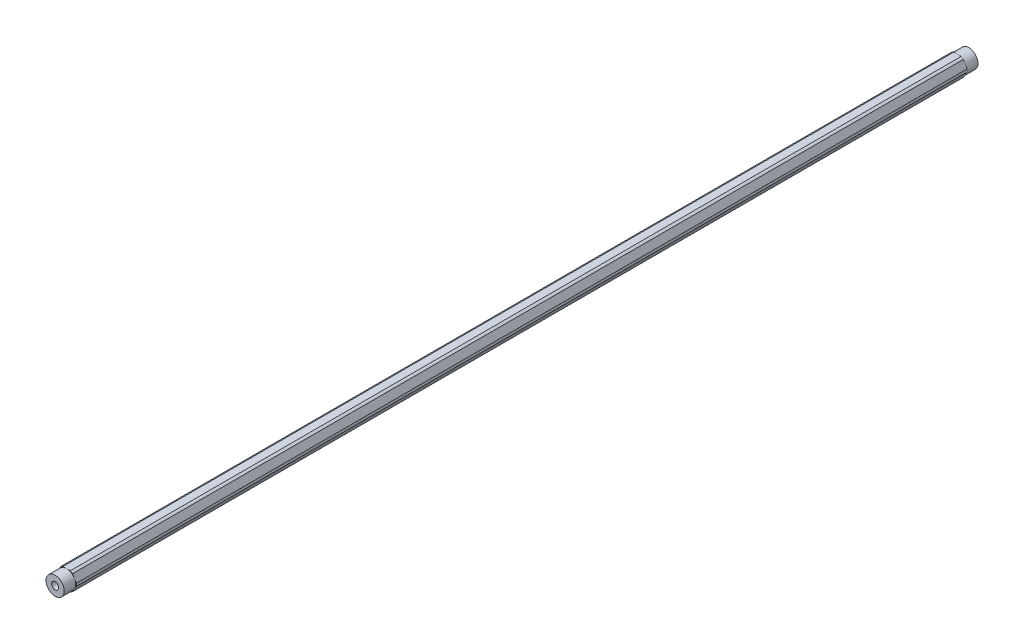
ISO-10303-21;
HEADER;
FILE_DESCRIPTION(('STEP AP214'),'2;1');
FILE_NAME('part.step','',(''),(''),'','','');
FILE_SCHEMA(('AUTOMOTIVE_DESIGN { 1 0 10303 214 1 1 1 1 }'));
ENDSEC;
DATA;
#1=APPLICATION_CONTEXT('core data for automotive mechanical design processes');
#2=APPLICATION_PROTOCOL_DEFINITION('international standard','automotive_design',2000,#1);
#3=PRODUCT_CONTEXT('',#1,'mechanical');
#4=PRODUCT('Part','Part','',(#3));
#5=PRODUCT_RELATED_PRODUCT_CATEGORY('part','',(#4));
#6=PRODUCT_DEFINITION_FORMATION('','',#4);
#7=PRODUCT_DEFINITION_CONTEXT('part definition',#1,'design');
#8=PRODUCT_DEFINITION('design','',#6,#7);
#9=PRODUCT_DEFINITION_SHAPE('','',#8);
#10=(LENGTH_UNIT() NAMED_UNIT(*) SI_UNIT(.MILLI.,.METRE.));
#11=(NAMED_UNIT(*) PLANE_ANGLE_UNIT() SI_UNIT($,.RADIAN.));
#12=(NAMED_UNIT(*) SI_UNIT($,.STERADIAN.) SOLID_ANGLE_UNIT());
#13=UNCERTAINTY_MEASURE_WITH_UNIT(LENGTH_MEASURE(1.E-05),#10,'distance_accuracy_value','');
#14=(GEOMETRIC_REPRESENTATION_CONTEXT(3) GLOBAL_UNCERTAINTY_ASSIGNED_CONTEXT((#13)) GLOBAL_UNIT_ASSIGNED_CONTEXT((#10,
#11,#12)) REPRESENTATION_CONTEXT('',''));
#15=CARTESIAN_POINT('',(0.,0.,0.));
#16=DIRECTION('',(0.,0.,1.));
#17=DIRECTION('',(1.,0.,0.));
#18=AXIS2_PLACEMENT_3D('',#15,#16,#17);
#19=CARTESIAN_POINT('',(3.66617420935413,-6.35,317.5));
#20=DIRECTION('',(-0.866025403784439,0.499999999999999,0.));
#21=DIRECTION('',(-0.5,-0.866025403784439,0.));
#22=AXIS2_PLACEMENT_3D('',#19,#20,#21);
#23=PLANE('',#22);
#24=DIRECTION('',(0.,0.,1.));
#25=VECTOR('',#24,1.);
#26=CARTESIAN_POINT('',(4.20411035757863,-5.41826726004727,-317.5));
#27=LINE('',#26,#25);
#28=CARTESIAN_POINT('',(4.20411035757863,-5.41826726004727,-309.5498));
#29=VERTEX_POINT('',#28);
#30=CARTESIAN_POINT('',(4.20411035757863,-5.41826726004727,309.5498));
#31=VERTEX_POINT('',#30);
#32=EDGE_CURVE('E327',#29,#31,#27,.T.);
#33=ORIENTED_EDGE('',*,*,#32,.F.);
#34=DIRECTION('',(-0.5,-0.866025403784439,0.));
#35=VECTOR('',#34,1.);
#36=CARTESIAN_POINT('',(3.66617420935413,-6.35,-309.5498));
#37=LINE('',#36,#35);
#38=CARTESIAN_POINT('',(5.49926131403119,-3.175,-309.5498));
#39=VERTEX_POINT('',#38);
#40=EDGE_CURVE('E257',#39,#29,#37,.T.);
#41=ORIENTED_EDGE('',*,*,#40,.F.);
#42=CARTESIAN_POINT('',(6.79441227048375,-0.931732739952732,-309.5498));
#43=VERTEX_POINT('',#42);
#44=EDGE_CURVE('E261',#43,#39,#37,.T.);
#45=ORIENTED_EDGE('',*,*,#44,.F.);
#46=DIRECTION('',(0.,0.,1.));
#47=VECTOR('',#46,1.);
#48=CARTESIAN_POINT('',(6.79441227048375,-0.93173273995273,-317.5));
#49=LINE('',#48,#47);
#50=CARTESIAN_POINT('',(6.79441227048375,-0.93173273995273,309.5498));
#51=VERTEX_POINT('',#50);
#52=EDGE_CURVE('E299',#51,#43,#49,.F.);
#53=ORIENTED_EDGE('',*,*,#52,.F.);
#54=DIRECTION('',(0.5,0.866025403784439,0.));
#55=VECTOR('',#54,1.);
#56=CARTESIAN_POINT('',(3.66617420935413,-6.35,309.5498));
#57=LINE('',#56,#55);
#58=CARTESIAN_POINT('',(5.49926131403119,-3.175,309.5498));
#59=VERTEX_POINT('',#58);
#60=EDGE_CURVE('E212',#59,#51,#57,.T.);
#61=ORIENTED_EDGE('',*,*,#60,.F.);
#62=EDGE_CURVE('E211',#31,#59,#57,.T.);
#63=ORIENTED_EDGE('',*,*,#62,.F.);
#64=EDGE_LOOP('',(#33,#41,#45,#53,#61,#63));
#65=FACE_BOUND('',#64,.T.);
#66=ADVANCED_FACE('F48',(#65),#23,.F.);
#67=CARTESIAN_POINT('',(7.33234841870825,0.,317.5));
#68=DIRECTION('',(-0.866025403784439,-0.5,0.));
#69=DIRECTION('',(0.5,-0.866025403784439,0.));
#70=AXIS2_PLACEMENT_3D('',#67,#68,#69);
#71=PLANE('',#70);
#72=DIRECTION('',(0.,0.,1.));
#73=VECTOR('',#72,1.);
#74=CARTESIAN_POINT('',(6.79441227048375,0.931732739952727,-317.5));
#75=LINE('',#74,#73);
#76=CARTESIAN_POINT('',(6.79441227048375,0.931732739952733,-309.5498));
#77=VERTEX_POINT('',#76);
#78=CARTESIAN_POINT('',(6.79441227048375,0.931732739952727,309.5498));
#79=VERTEX_POINT('',#78);
#80=EDGE_CURVE('E302',#77,#79,#75,.T.);
#81=ORIENTED_EDGE('',*,*,#80,.F.);
#82=DIRECTION('',(0.5,-0.866025403784439,0.));
#83=VECTOR('',#82,1.);
#84=CARTESIAN_POINT('',(7.33234841870825,0.,-309.5498));
#85=LINE('',#84,#83);
#86=CARTESIAN_POINT('',(5.49926131403119,3.175,-309.5498));
#87=VERTEX_POINT('',#86);
#88=EDGE_CURVE('E248',#87,#77,#85,.T.);
#89=ORIENTED_EDGE('',*,*,#88,.F.);
#90=CARTESIAN_POINT('',(4.20411035757862,5.41826726004727,-309.5498));
#91=VERTEX_POINT('',#90);
#92=EDGE_CURVE('E252',#91,#87,#85,.T.);
#93=ORIENTED_EDGE('',*,*,#92,.F.);
#94=DIRECTION('',(0.,0.,1.));
#95=VECTOR('',#94,1.);
#96=CARTESIAN_POINT('',(4.20411035757862,5.41826726004727,-317.5));
#97=LINE('',#96,#95);
#98=CARTESIAN_POINT('',(4.20411035757862,5.41826726004727,309.5498));
#99=VERTEX_POINT('',#98);
#100=EDGE_CURVE('E71',#99,#91,#97,.F.);
#101=ORIENTED_EDGE('',*,*,#100,.F.);
#102=DIRECTION('',(-0.5,0.866025403784439,0.));
#103=VECTOR('',#102,1.);
#104=CARTESIAN_POINT('',(7.33234841870825,0.,309.5498));
#105=LINE('',#104,#103);
#106=CARTESIAN_POINT('',(5.49926131403119,3.175,309.5498));
#107=VERTEX_POINT('',#106);
#108=EDGE_CURVE('E217',#107,#99,#105,.T.);
#109=ORIENTED_EDGE('',*,*,#108,.F.);
#110=EDGE_CURVE('E216',#79,#107,#105,.T.);
#111=ORIENTED_EDGE('',*,*,#110,.F.);
#112=EDGE_LOOP('',(#81,#89,#93,#101,#109,#111));
#113=FACE_BOUND('',#112,.T.);
#114=ADVANCED_FACE('F427',(#113),#71,.F.);
#115=CARTESIAN_POINT('',(3.66617420935412,6.35,317.5));
#116=DIRECTION('',(0.,-1.,0.));
#117=DIRECTION('',(0.,0.,-1.));
#118=AXIS2_PLACEMENT_3D('',#115,#116,#117);
#119=PLANE('',#118);
#120=DIRECTION('',(0.,0.,1.));
#121=VECTOR('',#120,1.);
#122=CARTESIAN_POINT('',(2.59030191290514,6.35,-317.5));
#123=LINE('',#122,#121);
#124=CARTESIAN_POINT('',(2.59030191290514,6.35,-309.5498));
#125=VERTEX_POINT('',#124);
#126=CARTESIAN_POINT('',(2.59030191290514,6.35,309.5498));
#127=VERTEX_POINT('',#126);
#128=EDGE_CURVE('E289',#125,#127,#123,.T.);
#129=ORIENTED_EDGE('',*,*,#128,.F.);
#130=DIRECTION('',(1.,0.,0.));
#131=VECTOR('',#130,1.);
#132=CARTESIAN_POINT('',(3.66617420935412,6.35,-309.5498));
#133=LINE('',#132,#131);
#134=CARTESIAN_POINT('',(0.,6.35,-309.5498));
#135=VERTEX_POINT('',#134);
#136=EDGE_CURVE('E242',#135,#125,#133,.T.);
#137=ORIENTED_EDGE('',*,*,#136,.F.);
#138=CARTESIAN_POINT('',(-2.59030191290514,6.35,-309.5498));
#139=VERTEX_POINT('',#138);
#140=EDGE_CURVE('E246',#139,#135,#133,.T.);
#141=ORIENTED_EDGE('',*,*,#140,.F.);
#142=DIRECTION('',(0.,0.,1.));
#143=VECTOR('',#142,1.);
#144=CARTESIAN_POINT('',(-2.59030191290514,6.35,-317.5));
#145=LINE('',#144,#143);
#146=CARTESIAN_POINT('',(-2.59030191290514,6.35,309.5498));
#147=VERTEX_POINT('',#146);
#148=EDGE_CURVE('E63',#147,#139,#145,.F.);
#149=ORIENTED_EDGE('',*,*,#148,.F.);
#150=DIRECTION('',(-1.,0.,0.));
#151=VECTOR('',#150,1.);
#152=CARTESIAN_POINT('',(3.66617420935412,6.35,309.5498));
#153=LINE('',#152,#151);
#154=CARTESIAN_POINT('',(0.,6.35,309.5498));
#155=VERTEX_POINT('',#154);
#156=EDGE_CURVE('E222',#155,#147,#153,.T.);
#157=ORIENTED_EDGE('',*,*,#156,.F.);
#158=EDGE_CURVE('E221',#127,#155,#153,.T.);
#159=ORIENTED_EDGE('',*,*,#158,.F.);
#160=EDGE_LOOP('',(#129,#137,#141,#149,#157,#159));
#161=FACE_BOUND('',#160,.T.);
#162=ADVANCED_FACE('F417',(#161),#119,.F.);
#163=CARTESIAN_POINT('',(-3.66617420935412,6.35,317.5));
#164=DIRECTION('',(0.866025403784439,-0.499999999999999,0.));
#165=DIRECTION('',(0.5,0.866025403784439,0.));
#166=AXIS2_PLACEMENT_3D('',#163,#164,#165);
#167=PLANE('',#166);
#168=DIRECTION('',(0.,0.,1.));
#169=VECTOR('',#168,1.);
#170=CARTESIAN_POINT('',(-4.20411035757862,5.41826726004727,-317.5));
#171=LINE('',#170,#169);
#172=CARTESIAN_POINT('',(-4.20411035757862,5.41826726004727,-309.5498));
#173=VERTEX_POINT('',#172);
#174=CARTESIAN_POINT('',(-4.20411035757862,5.41826726004727,309.5498));
#175=VERTEX_POINT('',#174);
#176=EDGE_CURVE('E277',#173,#175,#171,.T.);
#177=ORIENTED_EDGE('',*,*,#176,.F.);
#178=DIRECTION('',(0.5,0.866025403784439,0.));
#179=VECTOR('',#178,1.);
#180=CARTESIAN_POINT('',(-3.66617420935412,6.35,-309.5498));
#181=LINE('',#180,#179);
#182=CARTESIAN_POINT('',(-5.49926131403119,3.175,-309.5498));
#183=VERTEX_POINT('',#182);
#184=EDGE_CURVE('E247',#183,#173,#181,.T.);
#185=ORIENTED_EDGE('',*,*,#184,.F.);
#186=CARTESIAN_POINT('',(-6.79441227048376,0.931732739952722,-309.5498));
#187=VERTEX_POINT('',#186);
#188=EDGE_CURVE('E253',#187,#183,#181,.T.);
#189=ORIENTED_EDGE('',*,*,#188,.F.);
#190=DIRECTION('',(0.,0.,1.));
#191=VECTOR('',#190,1.);
#192=CARTESIAN_POINT('',(-6.79441227048375,0.931732739952721,-317.5));
#193=LINE('',#192,#191);
#194=CARTESIAN_POINT('',(-6.79441227048375,0.931732739952721,309.5498));
#195=VERTEX_POINT('',#194);
#196=EDGE_CURVE('E313',#195,#187,#193,.F.);
#197=ORIENTED_EDGE('',*,*,#196,.F.);
#198=DIRECTION('',(-0.5,-0.866025403784439,0.));
#199=VECTOR('',#198,1.);
#200=CARTESIAN_POINT('',(-3.66617420935412,6.35,309.5498));
#201=LINE('',#200,#199);
#202=CARTESIAN_POINT('',(-5.49926131403119,3.175,309.5498));
#203=VERTEX_POINT('',#202);
#204=EDGE_CURVE('E227',#203,#195,#201,.T.);
#205=ORIENTED_EDGE('',*,*,#204,.F.);
#206=EDGE_CURVE('E226',#175,#203,#201,.T.);
#207=ORIENTED_EDGE('',*,*,#206,.F.);
#208=EDGE_LOOP('',(#177,#185,#189,#197,#205,#207));
#209=FACE_BOUND('',#208,.T.);
#210=ADVANCED_FACE('F433',(#209),#167,.F.);
#211=CARTESIAN_POINT('',(-7.33234841870825,0.,317.5));
#212=DIRECTION('',(0.866025403784438,0.5,0.));
#213=DIRECTION('',(-0.5,0.866025403784439,0.));
#214=AXIS2_PLACEMENT_3D('',#211,#212,#213);
#215=PLANE('',#214);
#216=DIRECTION('',(0.,0.,1.));
#217=VECTOR('',#216,1.);
#218=CARTESIAN_POINT('',(-6.79441227048375,-0.931732739952721,-317.5));
#219=LINE('',#218,#217);
#220=CARTESIAN_POINT('',(-6.79441227048375,-0.931732739952727,-309.5498));
#221=VERTEX_POINT('',#220);
#222=CARTESIAN_POINT('',(-6.79441227048375,-0.931732739952721,309.5498));
#223=VERTEX_POINT('',#222);
#224=EDGE_CURVE('E316',#221,#223,#219,.T.);
#225=ORIENTED_EDGE('',*,*,#224,.F.);
#226=DIRECTION('',(-0.5,0.866025403784439,0.));
#227=VECTOR('',#226,1.);
#228=CARTESIAN_POINT('',(-7.33234841870825,0.,-309.5498));
#229=LINE('',#228,#227);
#230=CARTESIAN_POINT('',(-5.49926131403119,-3.175,-309.5498));
#231=VERTEX_POINT('',#230);
#232=EDGE_CURVE('E256',#231,#221,#229,.T.);
#233=ORIENTED_EDGE('',*,*,#232,.F.);
#234=CARTESIAN_POINT('',(-4.20411035757862,-5.41826726004728,-309.5498));
#235=VERTEX_POINT('',#234);
#236=EDGE_CURVE('E262',#235,#231,#229,.T.);
#237=ORIENTED_EDGE('',*,*,#236,.F.);
#238=DIRECTION('',(0.,0.,1.));
#239=VECTOR('',#238,1.);
#240=CARTESIAN_POINT('',(-4.20411035757861,-5.41826726004728,-317.5));
#241=LINE('',#240,#239);
#242=CARTESIAN_POINT('',(-4.20411035757861,-5.41826726004728,309.5498));
#243=VERTEX_POINT('',#242);
#244=EDGE_CURVE('E176',#243,#235,#241,.F.);
#245=ORIENTED_EDGE('',*,*,#244,.F.);
#246=DIRECTION('',(0.5,-0.866025403784439,0.));
#247=VECTOR('',#246,1.);
#248=CARTESIAN_POINT('',(-7.33234841870825,0.,309.5498));
#249=LINE('',#248,#247);
#250=CARTESIAN_POINT('',(-5.49926131403119,-3.175,309.5498));
#251=VERTEX_POINT('',#250);
#252=EDGE_CURVE('E232',#251,#243,#249,.T.);
#253=ORIENTED_EDGE('',*,*,#252,.F.);
#254=EDGE_CURVE('E231',#223,#251,#249,.T.);
#255=ORIENTED_EDGE('',*,*,#254,.F.);
#256=EDGE_LOOP('',(#225,#233,#237,#245,#253,#255));
#257=FACE_BOUND('',#256,.T.);
#258=ADVANCED_FACE('F450',(#257),#215,.F.);
#259=CARTESIAN_POINT('',(-3.66617420935412,-6.35000000000001,317.5));
#260=DIRECTION('',(0.,1.,0.));
#261=DIRECTION('',(-1.,0.,0.));
#262=AXIS2_PLACEMENT_3D('',#259,#260,#261);
#263=PLANE('',#262);
#264=DIRECTION('',(0.,0.,1.));
#265=VECTOR('',#264,1.);
#266=CARTESIAN_POINT('',(-2.59030191290513,-6.35,-317.5));
#267=LINE('',#266,#265);
#268=CARTESIAN_POINT('',(-2.59030191290512,-6.35000000000001,-309.5498));
#269=VERTEX_POINT('',#268);
#270=CARTESIAN_POINT('',(-2.59030191290513,-6.35,309.5498));
#271=VERTEX_POINT('',#270);
#272=EDGE_CURVE('E173',#269,#271,#267,.T.);
#273=ORIENTED_EDGE('',*,*,#272,.F.);
#274=DIRECTION('',(-1.,0.,0.));
#275=VECTOR('',#274,1.);
#276=CARTESIAN_POINT('',(-3.66617420935412,-6.35000000000001,-309.5498));
#277=LINE('',#276,#275);
#278=CARTESIAN_POINT('',(0.,-6.35,-309.5498));
#279=VERTEX_POINT('',#278);
#280=EDGE_CURVE('E185',#279,#269,#277,.T.);
#281=ORIENTED_EDGE('',*,*,#280,.F.);
#282=CARTESIAN_POINT('',(2.59030191290513,-6.35,-309.5498));
#283=VERTEX_POINT('',#282);
#284=EDGE_CURVE('E56',#283,#279,#277,.T.);
#285=ORIENTED_EDGE('',*,*,#284,.F.);
#286=DIRECTION('',(0.,0.,1.));
#287=VECTOR('',#286,1.);
#288=CARTESIAN_POINT('',(2.59030191290513,-6.35,-317.5));
#289=LINE('',#288,#287);
#290=CARTESIAN_POINT('',(2.59030191290513,-6.35,309.5498));
#291=VERTEX_POINT('',#290);
#292=EDGE_CURVE('E330',#291,#283,#289,.F.);
#293=ORIENTED_EDGE('',*,*,#292,.F.);
#294=DIRECTION('',(1.,0.,0.));
#295=VECTOR('',#294,1.);
#296=CARTESIAN_POINT('',(-3.66617420935412,-6.35000000000001,309.5498));
#297=LINE('',#296,#295);
#298=CARTESIAN_POINT('',(0.,-6.35,309.5498));
#299=VERTEX_POINT('',#298);
#300=EDGE_CURVE('E203',#299,#291,#297,.T.);
#301=ORIENTED_EDGE('',*,*,#300,.F.);
#302=EDGE_CURVE('E187',#271,#299,#297,.T.);
#303=ORIENTED_EDGE('',*,*,#302,.F.);
#304=EDGE_LOOP('',(#273,#281,#285,#293,#301,#303));
#305=FACE_BOUND('',#304,.T.);
#306=ADVANCED_FACE('F183',(#305),#263,.F.);
#307=CARTESIAN_POINT('',(0.,0.,309.5498));
#308=DIRECTION('',(0.,0.,1.));
#309=DIRECTION('',(1.,0.,0.));
#310=AXIS2_PLACEMENT_3D('',#307,#308,#309);
#311=PLANE('',#310);
#312=ORIENTED_EDGE('',*,*,#300,.T.);
#313=CARTESIAN_POINT('',(0.,0.,309.5498));
#314=DIRECTION('',(0.,0.,1.));
#315=DIRECTION('',(1.,0.,0.));
#316=AXIS2_PLACEMENT_3D('',#313,#314,#315);
#317=CIRCLE('',#316,6.858);
#318=EDGE_CURVE('E323',#291,#31,#317,.T.);
#319=ORIENTED_EDGE('',*,*,#318,.T.);
#320=ORIENTED_EDGE('',*,*,#62,.T.);
#321=CARTESIAN_POINT('',(0.,0.,309.5498));
#322=DIRECTION('',(0.,0.,1.));
#323=DIRECTION('',(1.,0.,0.));
#324=AXIS2_PLACEMENT_3D('',#321,#322,#323);
#325=CIRCLE('',#324,6.35);
#326=EDGE_CURVE('E375',#299,#59,#325,.T.);
#327=ORIENTED_EDGE('',*,*,#326,.F.);
#328=EDGE_LOOP('',(#312,#319,#320,#327));
#329=FACE_BOUND('',#328,.T.);
#330=ADVANCED_FACE('F480',(#329),#311,.T.);
#331=ORIENTED_EDGE('',*,*,#60,.T.);
#332=CARTESIAN_POINT('',(0.,0.,309.5498));
#333=DIRECTION('',(0.,0.,1.));
#334=DIRECTION('',(1.,0.,0.));
#335=AXIS2_PLACEMENT_3D('',#332,#333,#334);
#336=CIRCLE('',#335,6.858);
#337=EDGE_CURVE('E295',#51,#79,#336,.T.);
#338=ORIENTED_EDGE('',*,*,#337,.T.);
#339=ORIENTED_EDGE('',*,*,#110,.T.);
#340=EDGE_CURVE('E241',#59,#107,#325,.T.);
#341=ORIENTED_EDGE('',*,*,#340,.F.);
#342=EDGE_LOOP('',(#331,#338,#339,#341));
#343=FACE_BOUND('',#342,.T.);
#344=ADVANCED_FACE('F390',(#343),#311,.T.);
#345=ORIENTED_EDGE('',*,*,#108,.T.);
#346=CARTESIAN_POINT('',(0.,0.,309.5498));
#347=DIRECTION('',(0.,0.,1.));
#348=DIRECTION('',(1.,0.,0.));
#349=AXIS2_PLACEMENT_3D('',#346,#347,#348);
#350=CIRCLE('',#349,6.858);
#351=EDGE_CURVE('E283',#99,#127,#350,.T.);
#352=ORIENTED_EDGE('',*,*,#351,.T.);
#353=ORIENTED_EDGE('',*,*,#158,.T.);
#354=EDGE_CURVE('E236',#107,#155,#325,.T.);
#355=ORIENTED_EDGE('',*,*,#354,.F.);
#356=EDGE_LOOP('',(#345,#352,#353,#355));
#357=FACE_BOUND('',#356,.T.);
#358=ADVANCED_FACE('F422',(#357),#311,.T.);
#359=ORIENTED_EDGE('',*,*,#156,.T.);
#360=CARTESIAN_POINT('',(0.,0.,309.5498));
#361=DIRECTION('',(0.,0.,1.));
#362=DIRECTION('',(1.,0.,0.));
#363=AXIS2_PLACEMENT_3D('',#360,#361,#362);
#364=CIRCLE('',#363,6.858);
#365=EDGE_CURVE('E271',#147,#175,#364,.T.);
#366=ORIENTED_EDGE('',*,*,#365,.T.);
#367=ORIENTED_EDGE('',*,*,#206,.T.);
#368=EDGE_CURVE('E240',#155,#203,#325,.T.);
#369=ORIENTED_EDGE('',*,*,#368,.F.);
#370=EDGE_LOOP('',(#359,#366,#367,#369));
#371=FACE_BOUND('',#370,.T.);
#372=ADVANCED_FACE('F438',(#371),#311,.T.);
#373=ORIENTED_EDGE('',*,*,#204,.T.);
#374=CARTESIAN_POINT('',(0.,0.,309.5498));
#375=DIRECTION('',(0.,0.,1.));
#376=DIRECTION('',(1.,0.,0.));
#377=AXIS2_PLACEMENT_3D('',#374,#375,#376);
#378=CIRCLE('',#377,6.858);
#379=EDGE_CURVE('E309',#195,#223,#378,.T.);
#380=ORIENTED_EDGE('',*,*,#379,.T.);
#381=ORIENTED_EDGE('',*,*,#254,.T.);
#382=EDGE_CURVE('E442',#203,#251,#325,.T.);
#383=ORIENTED_EDGE('',*,*,#382,.F.);
#384=EDGE_LOOP('',(#373,#380,#381,#383));
#385=FACE_BOUND('',#384,.T.);
#386=ADVANCED_FACE('F459',(#385),#311,.T.);
#387=ORIENTED_EDGE('',*,*,#252,.T.);
#388=CARTESIAN_POINT('',(0.,0.,309.5498));
#389=DIRECTION('',(0.,0.,1.));
#390=DIRECTION('',(1.,0.,0.));
#391=AXIS2_PLACEMENT_3D('',#388,#389,#390);
#392=CIRCLE('',#391,6.858);
#393=EDGE_CURVE('E337',#243,#271,#392,.T.);
#394=ORIENTED_EDGE('',*,*,#393,.T.);
#395=ORIENTED_EDGE('',*,*,#302,.T.);
#396=EDGE_CURVE('E381',#251,#299,#325,.T.);
#397=ORIENTED_EDGE('',*,*,#396,.F.);
#398=EDGE_LOOP('',(#387,#394,#395,#397));
#399=FACE_BOUND('',#398,.T.);
#400=ADVANCED_FACE('F452',(#399),#311,.T.);
#401=CARTESIAN_POINT('',(0.,0.,-309.5498));
#402=DIRECTION('',(0.,0.,-1.));
#403=DIRECTION('',(-1.,0.,0.));
#404=AXIS2_PLACEMENT_3D('',#401,#402,#403);
#405=PLANE('',#404);
#406=ORIENTED_EDGE('',*,*,#184,.T.);
#407=CARTESIAN_POINT('',(0.,0.,-309.5498));
#408=DIRECTION('',(0.,0.,-1.));
#409=DIRECTION('',(-1.,0.,0.));
#410=AXIS2_PLACEMENT_3D('',#407,#408,#409);
#411=CIRCLE('',#410,6.858);
#412=EDGE_CURVE('E280',#173,#139,#411,.T.);
#413=ORIENTED_EDGE('',*,*,#412,.T.);
#414=ORIENTED_EDGE('',*,*,#140,.T.);
#415=CARTESIAN_POINT('',(0.,0.,-309.5498));
#416=DIRECTION('',(0.,0.,1.));
#417=DIRECTION('',(1.,0.,0.));
#418=AXIS2_PLACEMENT_3D('',#415,#416,#417);
#419=CIRCLE('',#418,6.35);
#420=EDGE_CURVE('E269',#135,#183,#419,.T.);
#421=ORIENTED_EDGE('',*,*,#420,.T.);
#422=EDGE_LOOP('',(#406,#413,#414,#421));
#423=FACE_BOUND('',#422,.T.);
#424=ADVANCED_FACE('F399',(#423),#405,.T.);
#425=ORIENTED_EDGE('',*,*,#136,.T.);
#426=CARTESIAN_POINT('',(0.,0.,-309.5498));
#427=DIRECTION('',(0.,0.,-1.));
#428=DIRECTION('',(-1.,0.,0.));
#429=AXIS2_PLACEMENT_3D('',#426,#427,#428);
#430=CIRCLE('',#429,6.858);
#431=EDGE_CURVE('E292',#125,#91,#430,.T.);
#432=ORIENTED_EDGE('',*,*,#431,.T.);
#433=ORIENTED_EDGE('',*,*,#92,.T.);
#434=EDGE_CURVE('E265',#87,#135,#419,.T.);
#435=ORIENTED_EDGE('',*,*,#434,.T.);
#436=EDGE_LOOP('',(#425,#432,#433,#435));
#437=FACE_BOUND('',#436,.T.);
#438=ADVANCED_FACE('F413',(#437),#405,.T.);
#439=ORIENTED_EDGE('',*,*,#88,.T.);
#440=CARTESIAN_POINT('',(0.,0.,-309.5498));
#441=DIRECTION('',(0.,0.,-1.));
#442=DIRECTION('',(-1.,0.,0.));
#443=AXIS2_PLACEMENT_3D('',#440,#441,#442);
#444=CIRCLE('',#443,6.858);
#445=EDGE_CURVE('E305',#77,#43,#444,.T.);
#446=ORIENTED_EDGE('',*,*,#445,.T.);
#447=ORIENTED_EDGE('',*,*,#44,.T.);
#448=EDGE_CURVE('E270',#39,#87,#419,.T.);
#449=ORIENTED_EDGE('',*,*,#448,.T.);
#450=EDGE_LOOP('',(#439,#446,#447,#449));
#451=FACE_BOUND('',#450,.T.);
#452=ADVANCED_FACE('F469',(#451),#405,.T.);
#453=ORIENTED_EDGE('',*,*,#232,.T.);
#454=CARTESIAN_POINT('',(0.,0.,-309.5498));
#455=DIRECTION('',(0.,0.,-1.));
#456=DIRECTION('',(-1.,0.,0.));
#457=AXIS2_PLACEMENT_3D('',#454,#455,#456);
#458=CIRCLE('',#457,6.858);
#459=EDGE_CURVE('E319',#221,#187,#458,.T.);
#460=ORIENTED_EDGE('',*,*,#459,.T.);
#461=ORIENTED_EDGE('',*,*,#188,.T.);
#462=EDGE_CURVE('E410',#183,#231,#419,.T.);
#463=ORIENTED_EDGE('',*,*,#462,.T.);
#464=EDGE_LOOP('',(#453,#460,#461,#463));
#465=FACE_BOUND('',#464,.T.);
#466=ADVANCED_FACE('F465',(#465),#405,.T.);
#467=ORIENTED_EDGE('',*,*,#40,.T.);
#468=CARTESIAN_POINT('',(0.,0.,-309.5498));
#469=DIRECTION('',(0.,0.,-1.));
#470=DIRECTION('',(-1.,0.,0.));
#471=AXIS2_PLACEMENT_3D('',#468,#469,#470);
#472=CIRCLE('',#471,6.858);
#473=EDGE_CURVE('E333',#29,#283,#472,.T.);
#474=ORIENTED_EDGE('',*,*,#473,.T.);
#475=ORIENTED_EDGE('',*,*,#284,.T.);
#476=EDGE_CURVE('E472',#279,#39,#419,.T.);
#477=ORIENTED_EDGE('',*,*,#476,.T.);
#478=EDGE_LOOP('',(#467,#474,#475,#477));
#479=FACE_BOUND('',#478,.T.);
#480=ADVANCED_FACE('F475',(#479),#405,.T.);
#481=ORIENTED_EDGE('',*,*,#280,.T.);
#482=CARTESIAN_POINT('',(0.,0.,-309.5498));
#483=DIRECTION('',(0.,0.,-1.));
#484=DIRECTION('',(-1.,0.,0.));
#485=AXIS2_PLACEMENT_3D('',#482,#483,#484);
#486=CIRCLE('',#485,6.858);
#487=EDGE_CURVE('E12',#269,#235,#486,.T.);
#488=ORIENTED_EDGE('',*,*,#487,.T.);
#489=ORIENTED_EDGE('',*,*,#236,.T.);
#490=EDGE_CURVE('E194',#231,#279,#419,.T.);
#491=ORIENTED_EDGE('',*,*,#490,.T.);
#492=EDGE_LOOP('',(#481,#488,#489,#491));
#493=FACE_BOUND('',#492,.T.);
#494=ADVANCED_FACE('F192',(#493),#405,.T.);
#495=CARTESIAN_POINT('',(0.,0.,309.5498));
#496=DIRECTION('',(0.,0.,1.));
#497=DIRECTION('',(1.,0.,0.));
#498=AXIS2_PLACEMENT_3D('',#495,#496,#497);
#499=CYLINDRICAL_SURFACE('',#498,6.35);
#500=CARTESIAN_POINT('',(0.,0.,317.5));
#501=DIRECTION('',(0.,0.,1.));
#502=DIRECTION('',(1.,0.,0.));
#503=AXIS2_PLACEMENT_3D('',#500,#501,#502);
#504=CIRCLE('',#503,6.35);
#505=CARTESIAN_POINT('',(6.35,0.,317.5));
#506=VERTEX_POINT('',#505);
#507=EDGE_CURVE('E207',#506,#506,#504,.T.);
#508=ORIENTED_EDGE('',*,*,#507,.F.);
#509=EDGE_LOOP('',(#508));
#510=FACE_BOUND('',#509,.T.);
#511=ORIENTED_EDGE('',*,*,#326,.T.);
#512=ORIENTED_EDGE('',*,*,#340,.T.);
#513=ORIENTED_EDGE('',*,*,#354,.T.);
#514=ORIENTED_EDGE('',*,*,#368,.T.);
#515=ORIENTED_EDGE('',*,*,#382,.T.);
#516=ORIENTED_EDGE('',*,*,#396,.T.);
#517=EDGE_LOOP('',(#511,#512,#513,#514,#515,#516));
#518=FACE_BOUND('',#517,.T.);
#519=ADVANCED_FACE('F364',(#510,#518),#499,.T.);
#520=CARTESIAN_POINT('',(0.,0.,317.5));
#521=DIRECTION('',(0.,0.,1.));
#522=DIRECTION('',(1.,0.,0.));
#523=AXIS2_PLACEMENT_3D('',#520,#521,#522);
#524=PLANE('',#523);
#525=CARTESIAN_POINT('',(0.,0.,317.5));
#526=DIRECTION('',(0.,0.,1.));
#527=DIRECTION('',(1.,0.,0.));
#528=AXIS2_PLACEMENT_3D('',#525,#526,#527);
#529=CIRCLE('',#528,2.4892);
#530=CARTESIAN_POINT('',(2.4892,0.,317.5));
#531=VERTEX_POINT('',#530);
#532=EDGE_CURVE('E342',#531,#531,#529,.T.);
#533=ORIENTED_EDGE('',*,*,#532,.F.);
#534=EDGE_LOOP('',(#533));
#535=FACE_BOUND('',#534,.T.);
#536=ORIENTED_EDGE('',*,*,#507,.T.);
#537=EDGE_LOOP('',(#536));
#538=FACE_BOUND('',#537,.T.);
#539=ADVANCED_FACE('F360',(#535,#538),#524,.T.);
#540=CARTESIAN_POINT('',(0.,0.,-309.5498));
#541=DIRECTION('',(0.,0.,-1.));
#542=DIRECTION('',(-1.,0.,0.));
#543=AXIS2_PLACEMENT_3D('',#540,#541,#542);
#544=CYLINDRICAL_SURFACE('',#543,6.35);
#545=ORIENTED_EDGE('',*,*,#448,.F.);
#546=ORIENTED_EDGE('',*,*,#476,.F.);
#547=ORIENTED_EDGE('',*,*,#490,.F.);
#548=ORIENTED_EDGE('',*,*,#462,.F.);
#549=ORIENTED_EDGE('',*,*,#420,.F.);
#550=ORIENTED_EDGE('',*,*,#434,.F.);
#551=EDGE_LOOP('',(#545,#546,#547,#548,#549,#550));
#552=FACE_BOUND('',#551,.T.);
#553=CARTESIAN_POINT('',(0.,0.,-317.5));
#554=DIRECTION('',(0.,0.,1.));
#555=DIRECTION('',(1.,0.,0.));
#556=AXIS2_PLACEMENT_3D('',#553,#554,#555);
#557=CIRCLE('',#556,6.35);
#558=CARTESIAN_POINT('',(6.35,0.,-317.5));
#559=VERTEX_POINT('',#558);
#560=EDGE_CURVE('E197',#559,#559,#557,.F.);
#561=ORIENTED_EDGE('',*,*,#560,.F.);
#562=EDGE_LOOP('',(#561));
#563=FACE_BOUND('',#562,.T.);
#564=ADVANCED_FACE('F363',(#552,#563),#544,.T.);
#565=CARTESIAN_POINT('',(0.,0.,-317.5));
#566=DIRECTION('',(0.,0.,1.));
#567=DIRECTION('',(1.,0.,0.));
#568=AXIS2_PLACEMENT_3D('',#565,#566,#567);
#569=PLANE('',#568);
#570=CARTESIAN_POINT('',(0.,0.,-317.5));
#571=DIRECTION('',(0.,0.,1.));
#572=DIRECTION('',(1.,0.,0.));
#573=AXIS2_PLACEMENT_3D('',#570,#571,#572);
#574=CIRCLE('',#573,2.4892);
#575=CARTESIAN_POINT('',(2.4892,0.,-317.5));
#576=VERTEX_POINT('',#575);
#577=EDGE_CURVE('E189',#576,#576,#574,.T.);
#578=ORIENTED_EDGE('',*,*,#577,.T.);
#579=EDGE_LOOP('',(#578));
#580=FACE_BOUND('',#579,.T.);
#581=ORIENTED_EDGE('',*,*,#560,.T.);
#582=EDGE_LOOP('',(#581));
#583=FACE_BOUND('',#582,.T.);
#584=ADVANCED_FACE('F350',(#580,#583),#569,.F.);
#585=CARTESIAN_POINT('',(0.,0.,-317.5));
#586=DIRECTION('',(0.,0.,1.));
#587=DIRECTION('',(1.,0.,0.));
#588=AXIS2_PLACEMENT_3D('',#585,#586,#587);
#589=CYLINDRICAL_SURFACE('',#588,6.858);
#590=ORIENTED_EDGE('',*,*,#244,.T.);
#591=ORIENTED_EDGE('',*,*,#487,.F.);
#592=ORIENTED_EDGE('',*,*,#272,.T.);
#593=ORIENTED_EDGE('',*,*,#393,.F.);
#594=EDGE_LOOP('',(#590,#591,#592,#593));
#595=FACE_BOUND('',#594,.T.);
#596=ADVANCED_FACE('F172',(#595),#589,.T.);
#597=ORIENTED_EDGE('',*,*,#292,.T.);
#598=ORIENTED_EDGE('',*,*,#473,.F.);
#599=ORIENTED_EDGE('',*,*,#32,.T.);
#600=ORIENTED_EDGE('',*,*,#318,.F.);
#601=EDGE_LOOP('',(#597,#598,#599,#600));
#602=FACE_BOUND('',#601,.T.);
#603=ADVANCED_FACE('F478',(#602),#589,.T.);
#604=ORIENTED_EDGE('',*,*,#196,.T.);
#605=ORIENTED_EDGE('',*,*,#459,.F.);
#606=ORIENTED_EDGE('',*,*,#224,.T.);
#607=ORIENTED_EDGE('',*,*,#379,.F.);
#608=EDGE_LOOP('',(#604,#605,#606,#607));
#609=FACE_BOUND('',#608,.T.);
#610=ADVANCED_FACE('F461',(#609),#589,.T.);
#611=ORIENTED_EDGE('',*,*,#52,.T.);
#612=ORIENTED_EDGE('',*,*,#445,.F.);
#613=ORIENTED_EDGE('',*,*,#80,.T.);
#614=ORIENTED_EDGE('',*,*,#337,.F.);
#615=EDGE_LOOP('',(#611,#612,#613,#614));
#616=FACE_BOUND('',#615,.T.);
#617=ADVANCED_FACE('F621',(#616),#589,.T.);
#618=ORIENTED_EDGE('',*,*,#100,.T.);
#619=ORIENTED_EDGE('',*,*,#431,.F.);
#620=ORIENTED_EDGE('',*,*,#128,.T.);
#621=ORIENTED_EDGE('',*,*,#351,.F.);
#622=EDGE_LOOP('',(#618,#619,#620,#621));
#623=FACE_BOUND('',#622,.T.);
#624=ADVANCED_FACE('F420',(#623),#589,.T.);
#625=ORIENTED_EDGE('',*,*,#148,.T.);
#626=ORIENTED_EDGE('',*,*,#412,.F.);
#627=ORIENTED_EDGE('',*,*,#176,.T.);
#628=ORIENTED_EDGE('',*,*,#365,.F.);
#629=EDGE_LOOP('',(#625,#626,#627,#628));
#630=FACE_BOUND('',#629,.T.);
#631=ADVANCED_FACE('F356',(#630),#589,.T.);
#632=CARTESIAN_POINT('',(0.,0.,-317.5));
#633=DIRECTION('',(0.,0.,1.));
#634=DIRECTION('',(1.,0.,0.));
#635=AXIS2_PLACEMENT_3D('',#632,#633,#634);
#636=CYLINDRICAL_SURFACE('',#635,2.4892);
#637=CARTESIAN_POINT('',(2.4892,0.,-317.5));
#638=CARTESIAN_POINT('',(2.4892,0.,-310.885416666667));
#639=CARTESIAN_POINT('',(2.4892,0.,-304.270833333333));
#640=CARTESIAN_POINT('',(2.4892,0.,-291.041666666667));
#641=CARTESIAN_POINT('',(2.4892,0.,-284.427083333333));
#642=CARTESIAN_POINT('',(2.4892,0.,-271.197916666667));
#643=CARTESIAN_POINT('',(2.4892,0.,-264.583333333333));
#644=CARTESIAN_POINT('',(2.4892,0.,-251.354166666667));
#645=CARTESIAN_POINT('',(2.4892,0.,-244.739583333333));
#646=CARTESIAN_POINT('',(2.4892,0.,-231.510416666667));
#647=CARTESIAN_POINT('',(2.4892,0.,-224.895833333333));
#648=CARTESIAN_POINT('',(2.4892,0.,-211.666666666667));
#649=CARTESIAN_POINT('',(2.4892,0.,-205.052083333333));
#650=CARTESIAN_POINT('',(2.4892,0.,-191.822916666667));
#651=CARTESIAN_POINT('',(2.4892,0.,-185.208333333333));
#652=CARTESIAN_POINT('',(2.4892,0.,-171.979166666667));
#653=CARTESIAN_POINT('',(2.4892,0.,-165.364583333333));
#654=CARTESIAN_POINT('',(2.4892,0.,-152.135416666667));
#655=CARTESIAN_POINT('',(2.4892,0.,-145.520833333333));
#656=CARTESIAN_POINT('',(2.4892,0.,-132.291666666667));
#657=CARTESIAN_POINT('',(2.4892,0.,-125.677083333333));
#658=CARTESIAN_POINT('',(2.4892,0.,-112.447916666667));
#659=CARTESIAN_POINT('',(2.4892,0.,-105.833333333333));
#660=CARTESIAN_POINT('',(2.4892,0.,-92.6041666666667));
#661=CARTESIAN_POINT('',(2.4892,0.,-85.9895833333334));
#662=CARTESIAN_POINT('',(2.4892,0.,-72.7604166666667));
#663=CARTESIAN_POINT('',(2.4892,0.,-66.1458333333334));
#664=CARTESIAN_POINT('',(2.4892,0.,-52.9166666666667));
#665=CARTESIAN_POINT('',(2.4892,0.,-46.3020833333334));
#666=CARTESIAN_POINT('',(2.4892,0.,-33.0729166666667));
#667=CARTESIAN_POINT('',(2.4892,0.,-26.4583333333334));
#668=CARTESIAN_POINT('',(2.4892,0.,-13.2291666666667));
#669=CARTESIAN_POINT('',(2.4892,0.,-6.61458333333339));
#670=CARTESIAN_POINT('',(2.4892,0.,6.61458333333328));
#671=CARTESIAN_POINT('',(2.4892,0.,13.2291666666666));
#672=CARTESIAN_POINT('',(2.4892,0.,26.4583333333333));
#673=CARTESIAN_POINT('',(2.4892,0.,33.0729166666666));
#674=CARTESIAN_POINT('',(2.4892,0.,46.3020833333333));
#675=CARTESIAN_POINT('',(2.4892,0.,52.9166666666666));
#676=CARTESIAN_POINT('',(2.4892,0.,66.1458333333333));
#677=CARTESIAN_POINT('',(2.4892,0.,72.7604166666666));
#678=CARTESIAN_POINT('',(2.4892,0.,85.9895833333333));
#679=CARTESIAN_POINT('',(2.4892,0.,92.6041666666666));
#680=CARTESIAN_POINT('',(2.4892,0.,105.833333333333));
#681=CARTESIAN_POINT('',(2.4892,0.,112.447916666667));
#682=CARTESIAN_POINT('',(2.4892,0.,125.677083333333));
#683=CARTESIAN_POINT('',(2.4892,0.,132.291666666667));
#684=CARTESIAN_POINT('',(2.4892,0.,145.520833333333));
#685=CARTESIAN_POINT('',(2.4892,0.,152.135416666667));
#686=CARTESIAN_POINT('',(2.4892,0.,165.364583333333));
#687=CARTESIAN_POINT('',(2.4892,0.,171.979166666667));
#688=CARTESIAN_POINT('',(2.4892,0.,185.208333333333));
#689=CARTESIAN_POINT('',(2.4892,0.,191.822916666667));
#690=CARTESIAN_POINT('',(2.4892,0.,205.052083333333));
#691=CARTESIAN_POINT('',(2.4892,0.,211.666666666667));
#692=CARTESIAN_POINT('',(2.4892,0.,224.895833333333));
#693=CARTESIAN_POINT('',(2.4892,0.,231.510416666667));
#694=CARTESIAN_POINT('',(2.4892,0.,244.739583333333));
#695=CARTESIAN_POINT('',(2.4892,0.,251.354166666667));
#696=CARTESIAN_POINT('',(2.4892,0.,264.583333333333));
#697=CARTESIAN_POINT('',(2.4892,0.,271.197916666667));
#698=CARTESIAN_POINT('',(2.4892,0.,284.427083333333));
#699=CARTESIAN_POINT('',(2.4892,0.,291.041666666667));
#700=CARTESIAN_POINT('',(2.4892,0.,304.270833333333));
#701=CARTESIAN_POINT('',(2.4892,0.,310.885416666667));
#702=CARTESIAN_POINT('',(2.4892,0.,317.5));
#703=B_SPLINE_CURVE_WITH_KNOTS('',3,(#637,#638,#639,#640,#641,#642,#643,#644,#645,#646,#647,
#648,#649,#650,#651,#652,#653,#654,#655,#656,#657,#658,#659,#660,#661,#662,#663,#664,#665,#666,
#667,#668,#669,#670,#671,#672,#673,#674,#675,#676,#677,#678,#679,#680,#681,#682,#683,#684,#685,
#686,#687,#688,#689,#690,#691,#692,#693,#694,#695,#696,#697,#698,#699,#700,#701,#702),
.UNSPECIFIED.,.F.,.F.,(4,2,2,2,2,2,2,2,2,2,2,2,2,2,2,2,2,2,2,2,2,2,2,2,2,2,2,2,2,2,2,2,4),(0.,
19.84375,39.6875,59.53125,79.375,99.21875,119.0625,138.90625,158.75,178.59375,198.4375,
218.28125,238.125,257.96875,277.8125,297.65625,317.5,337.34375,357.1875,377.03125,396.875,
416.71875,436.5625,456.40625,476.25,496.09375,515.9375,535.78125,555.625,575.46875,595.3125,
615.15625,635.),.UNSPECIFIED.);
#704=EDGE_CURVE('BSEAM353',#576,#531,#703,.T.);
#705=ORIENTED_EDGE('',*,*,#577,.F.);
#706=ORIENTED_EDGE('',*,*,#532,.T.);
#707=ORIENTED_EDGE('',*,*,#704,.T.);
#708=ORIENTED_EDGE('',*,*,#704,.F.);
#709=EDGE_LOOP('',(#705,#707,#706,#708));
#710=FACE_BOUND('',#709,.T.);
#711=ADVANCED_FACE('F353',(#710),#636,.F.);
#712=CLOSED_SHELL('',(#66,#114,#162,#210,#258,#306,#330,#344,#358,#372,#386,#400,#424,#438,#452,
#466,#480,#494,#519,#539,#564,#584,#596,#603,#610,#617,#624,#631,#711));
#713=MANIFOLD_SOLID_BREP('B2',#712);
#714=ADVANCED_BREP_SHAPE_REPRESENTATION('',(#18,#713),#14);
#715=SHAPE_DEFINITION_REPRESENTATION(#9,#714);
ENDSEC;
END-ISO-10303-21;
